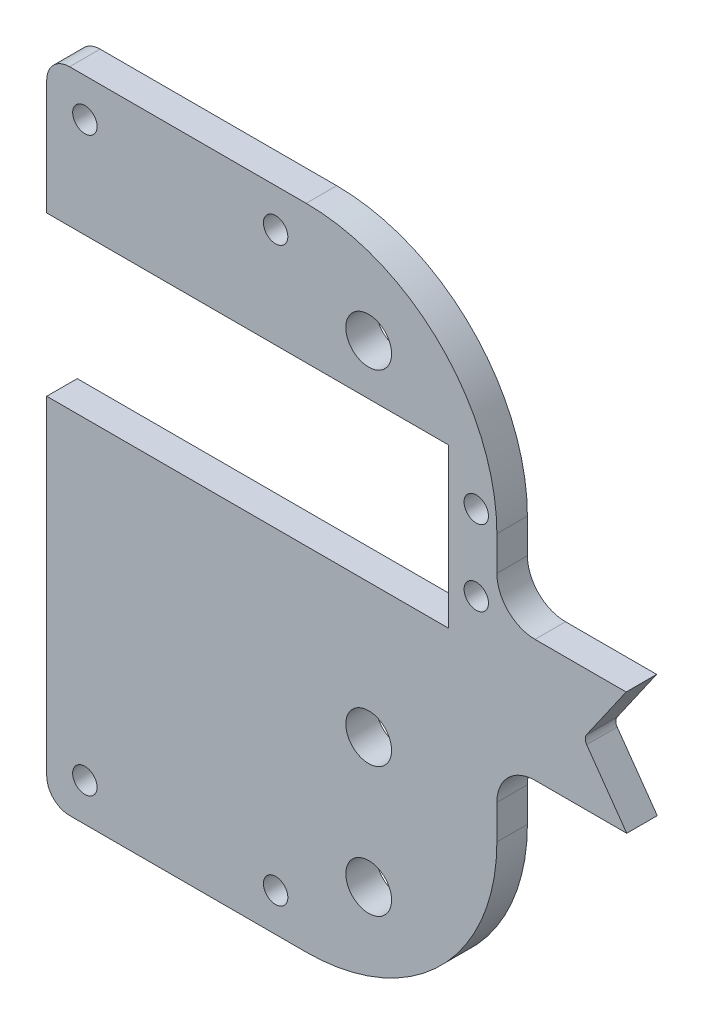
ISO-10303-21;
HEADER;
FILE_DESCRIPTION(('STEP AP214'),'2;1');
FILE_NAME('part.step','',(''),(''),'','','');
FILE_SCHEMA(('AUTOMOTIVE_DESIGN { 1 0 10303 214 1 1 1 1 }'));
ENDSEC;
DATA;
#1=APPLICATION_CONTEXT('core data for automotive mechanical design processes');
#2=APPLICATION_PROTOCOL_DEFINITION('international standard','automotive_design',2000,#1);
#3=PRODUCT_CONTEXT('',#1,'mechanical');
#4=PRODUCT('Part','Part','',(#3));
#5=PRODUCT_RELATED_PRODUCT_CATEGORY('part','',(#4));
#6=PRODUCT_DEFINITION_FORMATION('','',#4);
#7=PRODUCT_DEFINITION_CONTEXT('part definition',#1,'design');
#8=PRODUCT_DEFINITION('design','',#6,#7);
#9=PRODUCT_DEFINITION_SHAPE('','',#8);
#10=(LENGTH_UNIT() NAMED_UNIT(*) SI_UNIT(.MILLI.,.METRE.));
#11=(NAMED_UNIT(*) PLANE_ANGLE_UNIT() SI_UNIT($,.RADIAN.));
#12=(NAMED_UNIT(*) SI_UNIT($,.STERADIAN.) SOLID_ANGLE_UNIT());
#13=UNCERTAINTY_MEASURE_WITH_UNIT(LENGTH_MEASURE(1.E-05),#10,'distance_accuracy_value','');
#14=(GEOMETRIC_REPRESENTATION_CONTEXT(3) GLOBAL_UNCERTAINTY_ASSIGNED_CONTEXT((#13)) GLOBAL_UNIT_ASSIGNED_CONTEXT((#10,
#11,#12)) REPRESENTATION_CONTEXT('',''));
#15=CARTESIAN_POINT('',(0.,0.,0.));
#16=DIRECTION('',(0.,0.,1.));
#17=DIRECTION('',(1.,0.,0.));
#18=AXIS2_PLACEMENT_3D('',#15,#16,#17);
#19=CARTESIAN_POINT('',(26.9999999999998,0.,4.));
#20=DIRECTION('',(-1.,0.,0.));
#21=DIRECTION('',(0.,0.,1.));
#22=AXIS2_PLACEMENT_3D('',#19,#20,#21);
#23=PLANE('',#22);
#24=DIRECTION('',(0.,1.,0.));
#25=VECTOR('',#24,1.);
#26=CARTESIAN_POINT('',(26.9999999999998,0.,0.));
#27=LINE('',#26,#25);
#28=CARTESIAN_POINT('',(26.9999999999998,-5.99999999999988,0.));
#29=VERTEX_POINT('',#28);
#30=CARTESIAN_POINT('',(26.9999999999998,-1.4999999999999,0.));
#31=VERTEX_POINT('',#30);
#32=EDGE_CURVE('E332',#29,#31,#27,.T.);
#33=ORIENTED_EDGE('',*,*,#32,.T.);
#34=DIRECTION('',(0.,0.,-1.));
#35=VECTOR('',#34,1.);
#36=CARTESIAN_POINT('',(26.9999999999998,-1.4999999999999,4.));
#37=LINE('',#36,#35);
#38=CARTESIAN_POINT('',(26.9999999999998,-1.4999999999999,4.));
#39=VERTEX_POINT('',#38);
#40=EDGE_CURVE('E419',#31,#39,#37,.F.);
#41=ORIENTED_EDGE('',*,*,#40,.T.);
#42=DIRECTION('',(0.,1.,0.));
#43=VECTOR('',#42,1.);
#44=CARTESIAN_POINT('',(26.9999999999998,0.,4.));
#45=LINE('',#44,#43);
#46=CARTESIAN_POINT('',(26.9999999999998,-5.99999999999988,4.));
#47=VERTEX_POINT('',#46);
#48=EDGE_CURVE('E289',#47,#39,#45,.T.);
#49=ORIENTED_EDGE('',*,*,#48,.F.);
#50=DIRECTION('',(0.,0.,-1.));
#51=VECTOR('',#50,1.);
#52=CARTESIAN_POINT('',(26.9999999999998,-5.99999999999988,4.));
#53=LINE('',#52,#51);
#54=EDGE_CURVE('E392',#47,#29,#53,.T.);
#55=ORIENTED_EDGE('',*,*,#54,.T.);
#56=EDGE_LOOP('',(#33,#41,#49,#55));
#57=FACE_BOUND('',#56,.T.);
#58=ADVANCED_FACE('F40',(#57),#23,.F.);
#59=CARTESIAN_POINT('',(20.65,0.,4.));
#60=DIRECTION('',(-1.,0.,0.));
#61=DIRECTION('',(0.,0.,1.));
#62=AXIS2_PLACEMENT_3D('',#59,#60,#61);
#63=PLANE('',#62);
#64=DIRECTION('',(0.,1.,0.));
#65=VECTOR('',#64,1.);
#66=CARTESIAN_POINT('',(20.65,0.,0.));
#67=LINE('',#66,#65);
#68=CARTESIAN_POINT('',(20.65,15.1,0.));
#69=VERTEX_POINT('',#68);
#70=CARTESIAN_POINT('',(20.65,35.9,0.));
#71=VERTEX_POINT('',#70);
#72=EDGE_CURVE('E315',#69,#71,#67,.T.);
#73=ORIENTED_EDGE('',*,*,#72,.F.);
#74=DIRECTION('',(0.,0.,-1.));
#75=VECTOR('',#74,1.);
#76=CARTESIAN_POINT('',(20.65,15.1,4.));
#77=LINE('',#76,#75);
#78=CARTESIAN_POINT('',(20.65,15.1,4.));
#79=VERTEX_POINT('',#78);
#80=EDGE_CURVE('E352',#79,#69,#77,.T.);
#81=ORIENTED_EDGE('',*,*,#80,.F.);
#82=DIRECTION('',(0.,1.,0.));
#83=VECTOR('',#82,1.);
#84=CARTESIAN_POINT('',(20.65,0.,4.));
#85=LINE('',#84,#83);
#86=CARTESIAN_POINT('',(20.65,35.9,4.));
#87=VERTEX_POINT('',#86);
#88=EDGE_CURVE('E272',#79,#87,#85,.T.);
#89=ORIENTED_EDGE('',*,*,#88,.T.);
#90=DIRECTION('',(0.,0.,-1.));
#91=VECTOR('',#90,1.);
#92=CARTESIAN_POINT('',(20.65,35.9,4.));
#93=LINE('',#92,#91);
#94=EDGE_CURVE('E299',#87,#71,#93,.T.);
#95=ORIENTED_EDGE('',*,*,#94,.T.);
#96=EDGE_LOOP('',(#73,#81,#89,#95));
#97=FACE_BOUND('',#96,.T.);
#98=ADVANCED_FACE('F537',(#97),#63,.T.);
#99=CARTESIAN_POINT('',(0.,15.1,4.));
#100=DIRECTION('',(0.,1.,0.));
#101=DIRECTION('',(0.,0.,1.));
#102=AXIS2_PLACEMENT_3D('',#99,#100,#101);
#103=PLANE('',#102);
#104=DIRECTION('',(1.,0.,0.));
#105=VECTOR('',#104,1.);
#106=CARTESIAN_POINT('',(0.,15.1,0.));
#107=LINE('',#106,#105);
#108=CARTESIAN_POINT('',(-32.0000000000001,15.1,0.));
#109=VERTEX_POINT('',#108);
#110=EDGE_CURVE('E319',#109,#69,#107,.T.);
#111=ORIENTED_EDGE('',*,*,#110,.F.);
#112=DIRECTION('',(0.,0.,-1.));
#113=VECTOR('',#112,1.);
#114=CARTESIAN_POINT('',(-32.0000000000001,15.1,4.));
#115=LINE('',#114,#113);
#116=CARTESIAN_POINT('',(-32.0000000000001,15.1,4.));
#117=VERTEX_POINT('',#116);
#118=EDGE_CURVE('E348',#117,#109,#115,.T.);
#119=ORIENTED_EDGE('',*,*,#118,.F.);
#120=DIRECTION('',(1.,0.,0.));
#121=VECTOR('',#120,1.);
#122=CARTESIAN_POINT('',(0.,15.1,4.));
#123=LINE('',#122,#121);
#124=EDGE_CURVE('E276',#117,#79,#123,.T.);
#125=ORIENTED_EDGE('',*,*,#124,.T.);
#126=ORIENTED_EDGE('',*,*,#80,.T.);
#127=EDGE_LOOP('',(#111,#119,#125,#126));
#128=FACE_BOUND('',#127,.T.);
#129=ADVANCED_FACE('F543',(#128),#103,.T.);
#130=CARTESIAN_POINT('',(-32.0000000000001,0.,4.));
#131=DIRECTION('',(-1.,0.,0.));
#132=DIRECTION('',(0.,0.,1.));
#133=AXIS2_PLACEMENT_3D('',#130,#131,#132);
#134=PLANE('',#133);
#135=DIRECTION('',(0.,1.,0.));
#136=VECTOR('',#135,1.);
#137=CARTESIAN_POINT('',(-32.0000000000001,0.,0.));
#138=LINE('',#137,#136);
#139=CARTESIAN_POINT('',(-32.0000000000001,-27.9999999999999,0.));
#140=VERTEX_POINT('',#139);
#141=EDGE_CURVE('E323',#140,#109,#138,.T.);
#142=ORIENTED_EDGE('',*,*,#141,.F.);
#143=DIRECTION('',(0.,0.,-1.));
#144=VECTOR('',#143,1.);
#145=CARTESIAN_POINT('',(-32.0000000000001,-27.9999999999999,4.));
#146=LINE('',#145,#144);
#147=CARTESIAN_POINT('',(-32.0000000000001,-27.9999999999999,4.));
#148=VERTEX_POINT('',#147);
#149=EDGE_CURVE('E378',#140,#148,#146,.F.);
#150=ORIENTED_EDGE('',*,*,#149,.T.);
#151=DIRECTION('',(0.,1.,0.));
#152=VECTOR('',#151,1.);
#153=CARTESIAN_POINT('',(-32.0000000000001,0.,4.));
#154=LINE('',#153,#152);
#155=EDGE_CURVE('E280',#148,#117,#154,.T.);
#156=ORIENTED_EDGE('',*,*,#155,.T.);
#157=ORIENTED_EDGE('',*,*,#118,.T.);
#158=EDGE_LOOP('',(#142,#150,#156,#157));
#159=FACE_BOUND('',#158,.T.);
#160=ADVANCED_FACE('F554',(#159),#134,.T.);
#161=CARTESIAN_POINT('',(0.,-30.9999999999999,4.));
#162=DIRECTION('',(0.,1.,0.));
#163=DIRECTION('',(0.,0.,1.));
#164=AXIS2_PLACEMENT_3D('',#161,#162,#163);
#165=PLANE('',#164);
#166=DIRECTION('',(1.,0.,0.));
#167=VECTOR('',#166,1.);
#168=CARTESIAN_POINT('',(0.,-30.9999999999999,0.));
#169=LINE('',#168,#167);
#170=CARTESIAN_POINT('',(-29.0000000000001,-30.9999999999999,0.));
#171=VERTEX_POINT('',#170);
#172=CARTESIAN_POINT('',(1.9999999999998,-30.9999999999999,0.));
#173=VERTEX_POINT('',#172);
#174=EDGE_CURVE('E326',#171,#173,#169,.T.);
#175=ORIENTED_EDGE('',*,*,#174,.T.);
#176=DIRECTION('',(0.,0.,-1.));
#177=VECTOR('',#176,1.);
#178=CARTESIAN_POINT('',(1.9999999999998,-30.9999999999999,4.));
#179=LINE('',#178,#177);
#180=CARTESIAN_POINT('',(1.9999999999998,-30.9999999999999,4.));
#181=VERTEX_POINT('',#180);
#182=EDGE_CURVE('E406',#173,#181,#179,.F.);
#183=ORIENTED_EDGE('',*,*,#182,.T.);
#184=DIRECTION('',(1.,0.,0.));
#185=VECTOR('',#184,1.);
#186=CARTESIAN_POINT('',(0.,-30.9999999999999,4.));
#187=LINE('',#186,#185);
#188=CARTESIAN_POINT('',(-29.0000000000001,-30.9999999999999,4.));
#189=VERTEX_POINT('',#188);
#190=EDGE_CURVE('E283',#189,#181,#187,.T.);
#191=ORIENTED_EDGE('',*,*,#190,.F.);
#192=DIRECTION('',(0.,0.,-1.));
#193=VECTOR('',#192,1.);
#194=CARTESIAN_POINT('',(-29.0000000000001,-30.9999999999999,0.));
#195=LINE('',#194,#193);
#196=EDGE_CURVE('E374',#189,#171,#195,.T.);
#197=ORIENTED_EDGE('',*,*,#196,.T.);
#198=EDGE_LOOP('',(#175,#183,#191,#197));
#199=FACE_BOUND('',#198,.T.);
#200=ADVANCED_FACE('F549',(#199),#165,.F.);
#201=CARTESIAN_POINT('',(26.9999999999998,24.5000000000001,4.));
#202=VERTEX_POINT('',#201);
#203=CARTESIAN_POINT('',(26.9999999999998,29.0000000000001,4.));
#204=VERTEX_POINT('',#203);
#205=EDGE_CURVE('E288',#202,#204,#45,.T.);
#206=ORIENTED_EDGE('',*,*,#205,.F.);
#207=DIRECTION('',(0.,0.,-1.));
#208=VECTOR('',#207,1.);
#209=CARTESIAN_POINT('',(26.9999999999998,24.5000000000001,4.));
#210=LINE('',#209,#208);
#211=CARTESIAN_POINT('',(26.9999999999998,24.5000000000001,0.));
#212=VERTEX_POINT('',#211);
#213=EDGE_CURVE('E409',#202,#212,#210,.T.);
#214=ORIENTED_EDGE('',*,*,#213,.T.);
#215=CARTESIAN_POINT('',(26.9999999999998,29.0000000000001,0.));
#216=VERTEX_POINT('',#215);
#217=EDGE_CURVE('E331',#212,#216,#27,.T.);
#218=ORIENTED_EDGE('',*,*,#217,.T.);
#219=DIRECTION('',(0.,0.,-1.));
#220=VECTOR('',#219,1.);
#221=CARTESIAN_POINT('',(26.9999999999998,29.0000000000001,4.));
#222=LINE('',#221,#220);
#223=EDGE_CURVE('E396',#216,#204,#222,.F.);
#224=ORIENTED_EDGE('',*,*,#223,.T.);
#225=EDGE_LOOP('',(#206,#214,#218,#224));
#226=FACE_BOUND('',#225,.T.);
#227=ADVANCED_FACE('F516',(#226),#23,.F.);
#228=CARTESIAN_POINT('',(0.,54.0000000000001,4.));
#229=DIRECTION('',(0.,1.,0.));
#230=DIRECTION('',(0.,0.,1.));
#231=AXIS2_PLACEMENT_3D('',#228,#229,#230);
#232=PLANE('',#231);
#233=DIRECTION('',(1.,0.,0.));
#234=VECTOR('',#233,1.);
#235=CARTESIAN_POINT('',(0.,54.0000000000001,4.));
#236=LINE('',#235,#234);
#237=CARTESIAN_POINT('',(-29.0000000000001,54.0000000000001,4.));
#238=VERTEX_POINT('',#237);
#239=CARTESIAN_POINT('',(1.9999999999998,54.0000000000001,4.));
#240=VERTEX_POINT('',#239);
#241=EDGE_CURVE('E292',#238,#240,#236,.T.);
#242=ORIENTED_EDGE('',*,*,#241,.T.);
#243=DIRECTION('',(0.,0.,-1.));
#244=VECTOR('',#243,1.);
#245=CARTESIAN_POINT('',(1.9999999999998,54.0000000000001,0.));
#246=LINE('',#245,#244);
#247=CARTESIAN_POINT('',(1.9999999999998,54.0000000000001,0.));
#248=VERTEX_POINT('',#247);
#249=EDGE_CURVE('E381',#240,#248,#246,.T.);
#250=ORIENTED_EDGE('',*,*,#249,.T.);
#251=DIRECTION('',(1.,0.,0.));
#252=VECTOR('',#251,1.);
#253=CARTESIAN_POINT('',(0.,54.0000000000001,0.));
#254=LINE('',#253,#252);
#255=CARTESIAN_POINT('',(-29.0000000000001,54.0000000000001,0.));
#256=VERTEX_POINT('',#255);
#257=EDGE_CURVE('E336',#256,#248,#254,.T.);
#258=ORIENTED_EDGE('',*,*,#257,.F.);
#259=DIRECTION('',(0.,0.,-1.));
#260=VECTOR('',#259,1.);
#261=CARTESIAN_POINT('',(-29.0000000000001,54.0000000000001,4.));
#262=LINE('',#261,#260);
#263=EDGE_CURVE('E365',#256,#238,#262,.F.);
#264=ORIENTED_EDGE('',*,*,#263,.T.);
#265=EDGE_LOOP('',(#242,#250,#258,#264));
#266=FACE_BOUND('',#265,.T.);
#267=ADVANCED_FACE('F499',(#266),#232,.T.);
#268=CARTESIAN_POINT('',(-32.0000000000001,35.9,4.));
#269=VERTEX_POINT('',#268);
#270=CARTESIAN_POINT('',(-32.0000000000001,51.0000000000001,4.));
#271=VERTEX_POINT('',#270);
#272=EDGE_CURVE('E284',#269,#271,#154,.T.);
#273=ORIENTED_EDGE('',*,*,#272,.T.);
#274=DIRECTION('',(0.,0.,-1.));
#275=VECTOR('',#274,1.);
#276=CARTESIAN_POINT('',(-32.0000000000001,51.0000000000001,4.));
#277=LINE('',#276,#275);
#278=CARTESIAN_POINT('',(-32.0000000000001,51.0000000000001,0.));
#279=VERTEX_POINT('',#278);
#280=EDGE_CURVE('E355',#271,#279,#277,.T.);
#281=ORIENTED_EDGE('',*,*,#280,.T.);
#282=CARTESIAN_POINT('',(-32.0000000000001,35.9,0.));
#283=VERTEX_POINT('',#282);
#284=EDGE_CURVE('E327',#283,#279,#138,.T.);
#285=ORIENTED_EDGE('',*,*,#284,.F.);
#286=DIRECTION('',(0.,0.,-1.));
#287=VECTOR('',#286,1.);
#288=CARTESIAN_POINT('',(-32.0000000000001,35.9,4.));
#289=LINE('',#288,#287);
#290=EDGE_CURVE('E345',#269,#283,#289,.T.);
#291=ORIENTED_EDGE('',*,*,#290,.F.);
#292=EDGE_LOOP('',(#273,#281,#285,#291));
#293=FACE_BOUND('',#292,.T.);
#294=ADVANCED_FACE('F485',(#293),#134,.T.);
#295=CARTESIAN_POINT('',(24.2999999999991,30.4499999999996,4.));
#296=DIRECTION('',(0.,0.,-1.));
#297=DIRECTION('',(-1.,0.,0.));
#298=AXIS2_PLACEMENT_3D('',#295,#296,#297);
#299=CYLINDRICAL_SURFACE('',#298,1.60000000000101);
#300=CARTESIAN_POINT('',(24.2999999999991,30.4499999999996,4.));
#301=DIRECTION('',(0.,0.,1.));
#302=DIRECTION('',(1.,0.,0.));
#303=AXIS2_PLACEMENT_3D('',#300,#301,#302);
#304=CIRCLE('',#303,1.60000000000101);
#305=CARTESIAN_POINT('',(25.9000000000001,30.4499999999996,4.));
#306=VERTEX_POINT('',#305);
#307=EDGE_CURVE('E268',#306,#306,#304,.T.);
#308=ORIENTED_EDGE('',*,*,#307,.T.);
#309=EDGE_LOOP('',(#308));
#310=FACE_BOUND('',#309,.T.);
#311=CARTESIAN_POINT('',(24.2999999999991,30.4499999999996,0.));
#312=DIRECTION('',(0.,0.,1.));
#313=DIRECTION('',(1.,0.,0.));
#314=AXIS2_PLACEMENT_3D('',#311,#312,#313);
#315=CIRCLE('',#314,1.60000000000101);
#316=CARTESIAN_POINT('',(25.9000000000001,30.4499999999996,0.));
#317=VERTEX_POINT('',#316);
#318=EDGE_CURVE('E311',#317,#317,#315,.T.);
#319=ORIENTED_EDGE('',*,*,#318,.F.);
#320=EDGE_LOOP('',(#319));
#321=FACE_BOUND('',#320,.T.);
#322=ADVANCED_FACE('F481',(#310,#321),#299,.F.);
#323=CARTESIAN_POINT('',(24.2999999999993,20.5499999999996,4.));
#324=DIRECTION('',(0.,0.,-1.));
#325=DIRECTION('',(-1.,0.,0.));
#326=AXIS2_PLACEMENT_3D('',#323,#324,#325);
#327=CYLINDRICAL_SURFACE('',#326,1.60000000000081);
#328=CARTESIAN_POINT('',(24.2999999999993,20.5499999999996,4.));
#329=DIRECTION('',(0.,0.,1.));
#330=DIRECTION('',(1.,0.,0.));
#331=AXIS2_PLACEMENT_3D('',#328,#329,#330);
#332=CIRCLE('',#331,1.60000000000081);
#333=CARTESIAN_POINT('',(25.9000000000001,20.5499999999996,4.));
#334=VERTEX_POINT('',#333);
#335=EDGE_CURVE('E264',#334,#334,#332,.T.);
#336=ORIENTED_EDGE('',*,*,#335,.T.);
#337=EDGE_LOOP('',(#336));
#338=FACE_BOUND('',#337,.T.);
#339=CARTESIAN_POINT('',(24.2999999999993,20.5499999999996,0.));
#340=DIRECTION('',(0.,0.,1.));
#341=DIRECTION('',(1.,0.,0.));
#342=AXIS2_PLACEMENT_3D('',#339,#340,#341);
#343=CIRCLE('',#342,1.60000000000081);
#344=CARTESIAN_POINT('',(25.9000000000001,20.5499999999996,0.));
#345=VERTEX_POINT('',#344);
#346=EDGE_CURVE('E307',#345,#345,#343,.T.);
#347=ORIENTED_EDGE('',*,*,#346,.F.);
#348=EDGE_LOOP('',(#347));
#349=FACE_BOUND('',#348,.T.);
#350=ADVANCED_FACE('F484',(#338,#349),#327,.F.);
#351=CARTESIAN_POINT('',(10.1999999999959,-19.5000000000021,4.));
#352=DIRECTION('',(0.,0.,-1.));
#353=DIRECTION('',(-1.,0.,0.));
#354=AXIS2_PLACEMENT_3D('',#351,#352,#353);
#355=CYLINDRICAL_SURFACE('',#354,3.0000000000037);
#356=CARTESIAN_POINT('',(10.1999999999959,-19.5000000000021,4.));
#357=DIRECTION('',(0.,0.,1.));
#358=DIRECTION('',(1.,0.,0.));
#359=AXIS2_PLACEMENT_3D('',#356,#357,#358);
#360=CIRCLE('',#359,3.0000000000037);
#361=CARTESIAN_POINT('',(13.1999999999996,-19.5000000000021,4.));
#362=VERTEX_POINT('',#361);
#363=EDGE_CURVE('E259',#362,#362,#360,.T.);
#364=ORIENTED_EDGE('',*,*,#363,.T.);
#365=EDGE_LOOP('',(#364));
#366=FACE_BOUND('',#365,.T.);
#367=CARTESIAN_POINT('',(10.1999999999959,-19.5000000000021,0.));
#368=DIRECTION('',(0.,0.,1.));
#369=DIRECTION('',(1.,0.,0.));
#370=AXIS2_PLACEMENT_3D('',#367,#368,#369);
#371=CIRCLE('',#370,3.0000000000037);
#372=CARTESIAN_POINT('',(13.1999999999996,-19.5000000000021,0.));
#373=VERTEX_POINT('',#372);
#374=EDGE_CURVE('E303',#373,#373,#371,.T.);
#375=ORIENTED_EDGE('',*,*,#374,.F.);
#376=EDGE_LOOP('',(#375));
#377=FACE_BOUND('',#376,.T.);
#378=ADVANCED_FACE('F567',(#366,#377),#355,.F.);
#379=CARTESIAN_POINT('',(10.1999999999994,42.4999999999991,4.));
#380=DIRECTION('',(0.,0.,-1.));
#381=DIRECTION('',(-1.,0.,0.));
#382=AXIS2_PLACEMENT_3D('',#379,#380,#381);
#383=CYLINDRICAL_SURFACE('',#382,3.00000000000011);
#384=CARTESIAN_POINT('',(10.1999999999994,42.4999999999991,4.));
#385=DIRECTION('',(0.,0.,1.));
#386=DIRECTION('',(1.,0.,0.));
#387=AXIS2_PLACEMENT_3D('',#384,#385,#386);
#388=CIRCLE('',#387,3.00000000000011);
#389=CARTESIAN_POINT('',(13.1999999999995,42.4999999999991,4.));
#390=VERTEX_POINT('',#389);
#391=EDGE_CURVE('E255',#390,#390,#388,.T.);
#392=ORIENTED_EDGE('',*,*,#391,.T.);
#393=EDGE_LOOP('',(#392));
#394=FACE_BOUND('',#393,.T.);
#395=CARTESIAN_POINT('',(10.1999999999994,42.4999999999991,0.));
#396=DIRECTION('',(0.,0.,1.));
#397=DIRECTION('',(1.,0.,0.));
#398=AXIS2_PLACEMENT_3D('',#395,#396,#397);
#399=CIRCLE('',#398,3.00000000000011);
#400=CARTESIAN_POINT('',(13.1999999999995,42.4999999999991,0.));
#401=VERTEX_POINT('',#400);
#402=EDGE_CURVE('E254',#401,#401,#399,.T.);
#403=ORIENTED_EDGE('',*,*,#402,.F.);
#404=EDGE_LOOP('',(#403));
#405=FACE_BOUND('',#404,.T.);
#406=ADVANCED_FACE('F571',(#394,#405),#383,.F.);
#407=CARTESIAN_POINT('',(0.,35.9,4.));
#408=DIRECTION('',(0.,1.,0.));
#409=DIRECTION('',(0.,0.,1.));
#410=AXIS2_PLACEMENT_3D('',#407,#408,#409);
#411=PLANE('',#410);
#412=DIRECTION('',(1.,0.,0.));
#413=VECTOR('',#412,1.);
#414=CARTESIAN_POINT('',(0.,35.9,0.));
#415=LINE('',#414,#413);
#416=EDGE_CURVE('E260',#283,#71,#415,.T.);
#417=ORIENTED_EDGE('',*,*,#416,.T.);
#418=ORIENTED_EDGE('',*,*,#94,.F.);
#419=DIRECTION('',(1.,0.,0.));
#420=VECTOR('',#419,1.);
#421=CARTESIAN_POINT('',(0.,35.9,4.));
#422=LINE('',#421,#420);
#423=EDGE_CURVE('E296',#269,#87,#422,.T.);
#424=ORIENTED_EDGE('',*,*,#423,.F.);
#425=ORIENTED_EDGE('',*,*,#290,.T.);
#426=EDGE_LOOP('',(#417,#418,#424,#425));
#427=FACE_BOUND('',#426,.T.);
#428=ADVANCED_FACE('F464',(#427),#411,.F.);
#429=CARTESIAN_POINT('',(0.,0.,4.));
#430=DIRECTION('',(0.,0.,1.));
#431=DIRECTION('',(1.,0.,0.));
#432=AXIS2_PLACEMENT_3D('',#429,#430,#431);
#433=PLANE('',#432);
#434=CARTESIAN_POINT('',(-2.00000000000428,-26.0000000000021,4.));
#435=DIRECTION('',(0.,0.,1.));
#436=DIRECTION('',(1.,0.,0.));
#437=AXIS2_PLACEMENT_3D('',#434,#435,#436);
#438=CIRCLE('',#437,1.59999999999655);
#439=CARTESIAN_POINT('',(-0.400000000007735,-26.0000000000021,4.));
#440=VERTEX_POINT('',#439);
#441=EDGE_CURVE('E443',#440,#440,#438,.T.);
#442=ORIENTED_EDGE('',*,*,#441,.F.);
#443=EDGE_LOOP('',(#442));
#444=FACE_BOUND('',#443,.T.);
#445=CARTESIAN_POINT('',(-2.0000000000044,48.9999999999979,4.));
#446=DIRECTION('',(0.,0.,1.));
#447=DIRECTION('',(1.,0.,0.));
#448=AXIS2_PLACEMENT_3D('',#445,#446,#447);
#449=CIRCLE('',#448,1.59999999999655);
#450=CARTESIAN_POINT('',(-0.400000000007854,48.9999999999979,4.));
#451=VERTEX_POINT('',#450);
#452=EDGE_CURVE('E450',#451,#451,#449,.T.);
#453=ORIENTED_EDGE('',*,*,#452,.F.);
#454=EDGE_LOOP('',(#453));
#455=FACE_BOUND('',#454,.T.);
#456=CARTESIAN_POINT('',(10.1999999999956,-2.5000000000021,4.));
#457=DIRECTION('',(0.,0.,1.));
#458=DIRECTION('',(1.,0.,0.));
#459=AXIS2_PLACEMENT_3D('',#456,#457,#458);
#460=CIRCLE('',#459,2.99999999999695);
#461=CARTESIAN_POINT('',(13.1999999999926,-2.5000000000021,4.));
#462=VERTEX_POINT('',#461);
#463=EDGE_CURVE('E234',#462,#462,#460,.T.);
#464=ORIENTED_EDGE('',*,*,#463,.F.);
#465=EDGE_LOOP('',(#464));
#466=FACE_BOUND('',#465,.T.);
#467=CARTESIAN_POINT('',(-27.0000000000044,48.9999999999979,4.));
#468=DIRECTION('',(0.,0.,1.));
#469=DIRECTION('',(1.,0.,0.));
#470=AXIS2_PLACEMENT_3D('',#467,#468,#469);
#471=CIRCLE('',#470,1.59999999999655);
#472=CARTESIAN_POINT('',(-25.4000000000079,48.9999999999979,4.));
#473=VERTEX_POINT('',#472);
#474=EDGE_CURVE('E250',#473,#473,#471,.T.);
#475=ORIENTED_EDGE('',*,*,#474,.F.);
#476=EDGE_LOOP('',(#475));
#477=FACE_BOUND('',#476,.T.);
#478=CARTESIAN_POINT('',(-27.0000000000044,-26.0000000000021,4.));
#479=DIRECTION('',(0.,0.,1.));
#480=DIRECTION('',(1.,0.,0.));
#481=AXIS2_PLACEMENT_3D('',#478,#479,#480);
#482=CIRCLE('',#481,1.59999999999655);
#483=CARTESIAN_POINT('',(-25.4000000000079,-26.0000000000021,4.));
#484=VERTEX_POINT('',#483);
#485=EDGE_CURVE('E243',#484,#484,#482,.T.);
#486=ORIENTED_EDGE('',*,*,#485,.F.);
#487=EDGE_LOOP('',(#486));
#488=FACE_BOUND('',#487,.T.);
#489=ORIENTED_EDGE('',*,*,#391,.F.);
#490=EDGE_LOOP('',(#489));
#491=FACE_BOUND('',#490,.T.);
#492=ORIENTED_EDGE('',*,*,#363,.F.);
#493=EDGE_LOOP('',(#492));
#494=FACE_BOUND('',#493,.T.);
#495=ORIENTED_EDGE('',*,*,#335,.F.);
#496=EDGE_LOOP('',(#495));
#497=FACE_BOUND('',#496,.T.);
#498=ORIENTED_EDGE('',*,*,#307,.F.);
#499=EDGE_LOOP('',(#498));
#500=FACE_BOUND('',#499,.T.);
#501=ORIENTED_EDGE('',*,*,#48,.T.);
#502=CARTESIAN_POINT('',(31.9999999999998,-1.4999999999999,4.));
#503=DIRECTION('',(0.,0.,1.));
#504=DIRECTION('',(1.,0.,0.));
#505=AXIS2_PLACEMENT_3D('',#502,#503,#504);
#506=CIRCLE('',#505,5.);
#507=CARTESIAN_POINT('',(31.9999999999998,3.5000000000001,4.));
#508=VERTEX_POINT('',#507);
#509=EDGE_CURVE('E431',#39,#508,#506,.F.);
#510=ORIENTED_EDGE('',*,*,#509,.T.);
#511=DIRECTION('',(-1.,0.,0.));
#512=VECTOR('',#511,1.);
#513=CARTESIAN_POINT('',(44.0235612145208,3.5000000000001,4.));
#514=LINE('',#513,#512);
#515=CARTESIAN_POINT('',(44.0235612145208,3.5000000000001,4.));
#516=VERTEX_POINT('',#515);
#517=EDGE_CURVE('E201',#516,#508,#514,.T.);
#518=ORIENTED_EDGE('',*,*,#517,.F.);
#519=DIRECTION('',(0.577520932344641,-0.816375877095702,0.));
#520=VECTOR('',#519,1.);
#521=CARTESIAN_POINT('',(38.3641981828819,11.5000000000001,4.));
#522=LINE('',#521,#520);
#523=CARTESIAN_POINT('',(38.769915842531,10.9264829347319,4.));
#524=VERTEX_POINT('',#523);
#525=EDGE_CURVE('E207',#524,#516,#522,.T.);
#526=ORIENTED_EDGE('',*,*,#525,.F.);
#527=CARTESIAN_POINT('',(39.5862917196267,11.5040038670766,4.));
#528=DIRECTION('',(0.,0.,1.));
#529=DIRECTION('',(1.,0.,0.));
#530=AXIS2_PLACEMENT_3D('',#527,#528,#529);
#531=CIRCLE('',#530,1.);
#532=CARTESIAN_POINT('',(38.7661492185052,12.0761631786798,4.));
#533=VERTEX_POINT('',#532);
#534=EDGE_CURVE('E11',#524,#533,#531,.F.);
#535=ORIENTED_EDGE('',*,*,#534,.T.);
#536=DIRECTION('',(-0.572159311603183,-0.820142501121465,0.));
#537=VECTOR('',#536,1.);
#538=CARTESIAN_POINT('',(43.9452703582252,19.5000000000001,4.));
#539=LINE('',#538,#537);
#540=CARTESIAN_POINT('',(43.9452703582252,19.5000000000001,4.));
#541=VERTEX_POINT('',#540);
#542=EDGE_CURVE('E190',#541,#533,#539,.T.);
#543=ORIENTED_EDGE('',*,*,#542,.F.);
#544=DIRECTION('',(1.,0.,0.));
#545=VECTOR('',#544,1.);
#546=CARTESIAN_POINT('',(26.9999999999998,19.5000000000001,4.));
#547=LINE('',#546,#545);
#548=CARTESIAN_POINT('',(31.9999999999998,19.5000000000001,4.));
#549=VERTEX_POINT('',#548);
#550=EDGE_CURVE('E178',#549,#541,#547,.T.);
#551=ORIENTED_EDGE('',*,*,#550,.F.);
#552=CARTESIAN_POINT('',(31.9999999999998,24.5000000000001,4.));
#553=DIRECTION('',(0.,0.,1.));
#554=DIRECTION('',(1.,0.,0.));
#555=AXIS2_PLACEMENT_3D('',#552,#553,#554);
#556=CIRCLE('',#555,5.);
#557=EDGE_CURVE('E425',#549,#202,#556,.F.);
#558=ORIENTED_EDGE('',*,*,#557,.T.);
#559=ORIENTED_EDGE('',*,*,#205,.T.);
#560=CARTESIAN_POINT('',(1.9999999999998,29.0000000000001,4.));
#561=DIRECTION('',(0.,0.,1.));
#562=DIRECTION('',(1.,0.,0.));
#563=AXIS2_PLACEMENT_3D('',#560,#561,#562);
#564=CIRCLE('',#563,25.);
#565=EDGE_CURVE('E403',#204,#240,#564,.T.);
#566=ORIENTED_EDGE('',*,*,#565,.T.);
#567=ORIENTED_EDGE('',*,*,#241,.F.);
#568=CARTESIAN_POINT('',(-29.0000000000001,51.0000000000001,4.));
#569=DIRECTION('',(0.,0.,1.));
#570=DIRECTION('',(1.,0.,0.));
#571=AXIS2_PLACEMENT_3D('',#568,#569,#570);
#572=CIRCLE('',#571,3.);
#573=EDGE_CURVE('E371',#238,#271,#572,.T.);
#574=ORIENTED_EDGE('',*,*,#573,.T.);
#575=ORIENTED_EDGE('',*,*,#272,.F.);
#576=ORIENTED_EDGE('',*,*,#423,.T.);
#577=ORIENTED_EDGE('',*,*,#88,.F.);
#578=ORIENTED_EDGE('',*,*,#124,.F.);
#579=ORIENTED_EDGE('',*,*,#155,.F.);
#580=CARTESIAN_POINT('',(-29.0000000000001,-27.9999999999999,4.));
#581=DIRECTION('',(0.,0.,1.));
#582=DIRECTION('',(1.,0.,0.));
#583=AXIS2_PLACEMENT_3D('',#580,#581,#582);
#584=CIRCLE('',#583,3.);
#585=EDGE_CURVE('E368',#148,#189,#584,.T.);
#586=ORIENTED_EDGE('',*,*,#585,.T.);
#587=ORIENTED_EDGE('',*,*,#190,.T.);
#588=CARTESIAN_POINT('',(1.9999999999998,-5.99999999999988,4.));
#589=DIRECTION('',(0.,0.,1.));
#590=DIRECTION('',(1.,0.,0.));
#591=AXIS2_PLACEMENT_3D('',#588,#589,#590);
#592=CIRCLE('',#591,25.);
#593=EDGE_CURVE('E400',#181,#47,#592,.T.);
#594=ORIENTED_EDGE('',*,*,#593,.T.);
#595=EDGE_LOOP('',(#501,#510,#518,#526,#535,#543,#551,#558,#559,#566,#567,#574,#575,#576,#577,
#578,#579,#586,#587,#594));
#596=FACE_BOUND('',#595,.T.);
#597=ADVANCED_FACE('F204',(#444,#455,#466,#477,#488,#491,#494,#497,#500,#596),#433,.T.);
#598=CARTESIAN_POINT('',(0.,0.,0.));
#599=DIRECTION('',(0.,0.,1.));
#600=DIRECTION('',(1.,0.,0.));
#601=AXIS2_PLACEMENT_3D('',#598,#599,#600);
#602=PLANE('',#601);
#603=CARTESIAN_POINT('',(-2.00000000000428,-26.0000000000021,0.));
#604=DIRECTION('',(0.,0.,1.));
#605=DIRECTION('',(1.,0.,0.));
#606=AXIS2_PLACEMENT_3D('',#603,#604,#605);
#607=CIRCLE('',#606,1.59999999999655);
#608=CARTESIAN_POINT('',(-0.400000000007735,-26.0000000000021,0.));
#609=VERTEX_POINT('',#608);
#610=EDGE_CURVE('E44',#609,#609,#607,.T.);
#611=ORIENTED_EDGE('',*,*,#610,.T.);
#612=EDGE_LOOP('',(#611));
#613=FACE_BOUND('',#612,.T.);
#614=CARTESIAN_POINT('',(-2.0000000000044,48.9999999999979,0.));
#615=DIRECTION('',(0.,0.,1.));
#616=DIRECTION('',(1.,0.,0.));
#617=AXIS2_PLACEMENT_3D('',#614,#615,#616);
#618=CIRCLE('',#617,1.59999999999655);
#619=CARTESIAN_POINT('',(-0.400000000007854,48.9999999999979,0.));
#620=VERTEX_POINT('',#619);
#621=EDGE_CURVE('E440',#620,#620,#618,.T.);
#622=ORIENTED_EDGE('',*,*,#621,.T.);
#623=EDGE_LOOP('',(#622));
#624=FACE_BOUND('',#623,.T.);
#625=CARTESIAN_POINT('',(10.1999999999956,-2.5000000000021,0.));
#626=DIRECTION('',(0.,0.,-1.));
#627=DIRECTION('',(-1.,0.,0.));
#628=AXIS2_PLACEMENT_3D('',#625,#626,#627);
#629=CIRCLE('',#628,2.99999999999695);
#630=CARTESIAN_POINT('',(7.1999999999987,-2.5000000000021,0.));
#631=VERTEX_POINT('',#630);
#632=EDGE_CURVE('E229',#631,#631,#629,.T.);
#633=ORIENTED_EDGE('',*,*,#632,.F.);
#634=EDGE_LOOP('',(#633));
#635=FACE_BOUND('',#634,.T.);
#636=CARTESIAN_POINT('',(-27.0000000000044,48.9999999999979,0.));
#637=DIRECTION('',(0.,0.,-1.));
#638=DIRECTION('',(-1.,0.,0.));
#639=AXIS2_PLACEMENT_3D('',#636,#637,#638);
#640=CIRCLE('',#639,1.59999999999655);
#641=CARTESIAN_POINT('',(-28.6000000000009,48.9999999999979,0.));
#642=VERTEX_POINT('',#641);
#643=EDGE_CURVE('E239',#642,#642,#640,.T.);
#644=ORIENTED_EDGE('',*,*,#643,.F.);
#645=EDGE_LOOP('',(#644));
#646=FACE_BOUND('',#645,.T.);
#647=CARTESIAN_POINT('',(-27.0000000000044,-26.0000000000021,0.));
#648=DIRECTION('',(0.,0.,-1.));
#649=DIRECTION('',(-1.,0.,0.));
#650=AXIS2_PLACEMENT_3D('',#647,#648,#649);
#651=CIRCLE('',#650,1.59999999999655);
#652=CARTESIAN_POINT('',(-28.6000000000009,-26.0000000000021,0.));
#653=VERTEX_POINT('',#652);
#654=EDGE_CURVE('E238',#653,#653,#651,.T.);
#655=ORIENTED_EDGE('',*,*,#654,.F.);
#656=EDGE_LOOP('',(#655));
#657=FACE_BOUND('',#656,.T.);
#658=ORIENTED_EDGE('',*,*,#402,.T.);
#659=EDGE_LOOP('',(#658));
#660=FACE_BOUND('',#659,.T.);
#661=ORIENTED_EDGE('',*,*,#374,.T.);
#662=EDGE_LOOP('',(#661));
#663=FACE_BOUND('',#662,.T.);
#664=ORIENTED_EDGE('',*,*,#346,.T.);
#665=EDGE_LOOP('',(#664));
#666=FACE_BOUND('',#665,.T.);
#667=ORIENTED_EDGE('',*,*,#318,.T.);
#668=EDGE_LOOP('',(#667));
#669=FACE_BOUND('',#668,.T.);
#670=ORIENTED_EDGE('',*,*,#257,.T.);
#671=CARTESIAN_POINT('',(1.9999999999998,29.0000000000001,0.));
#672=DIRECTION('',(0.,0.,1.));
#673=DIRECTION('',(1.,0.,0.));
#674=AXIS2_PLACEMENT_3D('',#671,#672,#673);
#675=CIRCLE('',#674,25.);
#676=EDGE_CURVE('E388',#248,#216,#675,.F.);
#677=ORIENTED_EDGE('',*,*,#676,.T.);
#678=ORIENTED_EDGE('',*,*,#217,.F.);
#679=CARTESIAN_POINT('',(31.9999999999998,24.5000000000001,0.));
#680=DIRECTION('',(0.,0.,1.));
#681=DIRECTION('',(1.,0.,0.));
#682=AXIS2_PLACEMENT_3D('',#679,#680,#681);
#683=CIRCLE('',#682,5.);
#684=CARTESIAN_POINT('',(31.9999999999998,19.5000000000001,0.));
#685=VERTEX_POINT('',#684);
#686=EDGE_CURVE('E422',#212,#685,#683,.T.);
#687=ORIENTED_EDGE('',*,*,#686,.T.);
#688=DIRECTION('',(1.,0.,0.));
#689=VECTOR('',#688,1.);
#690=CARTESIAN_POINT('',(26.9999999999998,19.5000000000001,0.));
#691=LINE('',#690,#689);
#692=CARTESIAN_POINT('',(43.9452703582252,19.5000000000001,0.));
#693=VERTEX_POINT('',#692);
#694=EDGE_CURVE('E216',#685,#693,#691,.T.);
#695=ORIENTED_EDGE('',*,*,#694,.T.);
#696=DIRECTION('',(-0.572159311603183,-0.820142501121465,0.));
#697=VECTOR('',#696,1.);
#698=CARTESIAN_POINT('',(43.9452703582252,19.5000000000001,0.));
#699=LINE('',#698,#697);
#700=CARTESIAN_POINT('',(38.7661492185052,12.0761631786798,0.));
#701=VERTEX_POINT('',#700);
#702=EDGE_CURVE('E198',#693,#701,#699,.T.);
#703=ORIENTED_EDGE('',*,*,#702,.T.);
#704=CARTESIAN_POINT('',(39.5862917196267,11.5040038670766,0.));
#705=DIRECTION('',(0.,0.,1.));
#706=DIRECTION('',(1.,0.,0.));
#707=AXIS2_PLACEMENT_3D('',#704,#705,#706);
#708=CIRCLE('',#707,1.);
#709=CARTESIAN_POINT('',(38.769915842531,10.9264829347319,0.));
#710=VERTEX_POINT('',#709);
#711=EDGE_CURVE('E50',#701,#710,#708,.T.);
#712=ORIENTED_EDGE('',*,*,#711,.T.);
#713=DIRECTION('',(0.577520932344641,-0.816375877095702,0.));
#714=VECTOR('',#713,1.);
#715=CARTESIAN_POINT('',(38.3641981828819,11.5000000000001,0.));
#716=LINE('',#715,#714);
#717=CARTESIAN_POINT('',(44.0235612145208,3.5000000000001,0.));
#718=VERTEX_POINT('',#717);
#719=EDGE_CURVE('E221',#710,#718,#716,.T.);
#720=ORIENTED_EDGE('',*,*,#719,.T.);
#721=DIRECTION('',(-1.,0.,0.));
#722=VECTOR('',#721,1.);
#723=CARTESIAN_POINT('',(44.0235612145208,3.5000000000001,0.));
#724=LINE('',#723,#722);
#725=CARTESIAN_POINT('',(31.9999999999998,3.5000000000001,0.));
#726=VERTEX_POINT('',#725);
#727=EDGE_CURVE('E191',#718,#726,#724,.T.);
#728=ORIENTED_EDGE('',*,*,#727,.T.);
#729=CARTESIAN_POINT('',(31.9999999999998,-1.4999999999999,0.));
#730=DIRECTION('',(0.,0.,1.));
#731=DIRECTION('',(1.,0.,0.));
#732=AXIS2_PLACEMENT_3D('',#729,#730,#731);
#733=CIRCLE('',#732,5.);
#734=EDGE_CURVE('E428',#726,#31,#733,.T.);
#735=ORIENTED_EDGE('',*,*,#734,.T.);
#736=ORIENTED_EDGE('',*,*,#32,.F.);
#737=CARTESIAN_POINT('',(1.9999999999998,-5.99999999999988,0.));
#738=DIRECTION('',(0.,0.,1.));
#739=DIRECTION('',(1.,0.,0.));
#740=AXIS2_PLACEMENT_3D('',#737,#738,#739);
#741=CIRCLE('',#740,25.);
#742=EDGE_CURVE('E385',#29,#173,#741,.F.);
#743=ORIENTED_EDGE('',*,*,#742,.T.);
#744=ORIENTED_EDGE('',*,*,#174,.F.);
#745=CARTESIAN_POINT('',(-29.0000000000001,-27.9999999999999,0.));
#746=DIRECTION('',(0.,0.,1.));
#747=DIRECTION('',(1.,0.,0.));
#748=AXIS2_PLACEMENT_3D('',#745,#746,#747);
#749=CIRCLE('',#748,3.);
#750=EDGE_CURVE('E359',#171,#140,#749,.F.);
#751=ORIENTED_EDGE('',*,*,#750,.T.);
#752=ORIENTED_EDGE('',*,*,#141,.T.);
#753=ORIENTED_EDGE('',*,*,#110,.T.);
#754=ORIENTED_EDGE('',*,*,#72,.T.);
#755=ORIENTED_EDGE('',*,*,#416,.F.);
#756=ORIENTED_EDGE('',*,*,#284,.T.);
#757=CARTESIAN_POINT('',(-29.0000000000001,51.0000000000001,0.));
#758=DIRECTION('',(0.,0.,1.));
#759=DIRECTION('',(1.,0.,0.));
#760=AXIS2_PLACEMENT_3D('',#757,#758,#759);
#761=CIRCLE('',#760,3.);
#762=EDGE_CURVE('E362',#279,#256,#761,.F.);
#763=ORIENTED_EDGE('',*,*,#762,.T.);
#764=EDGE_LOOP('',(#670,#677,#678,#687,#695,#703,#712,#720,#728,#735,#736,#743,#744,#751,#752,
#753,#754,#755,#756,#763));
#765=FACE_BOUND('',#764,.T.);
#766=ADVANCED_FACE('F463',(#613,#624,#635,#646,#657,#660,#663,#666,#669,#765),#602,.F.);
#767=CARTESIAN_POINT('',(-29.0000000000001,51.0000000000001,4.));
#768=DIRECTION('',(0.,0.,-1.));
#769=DIRECTION('',(-1.,0.,0.));
#770=AXIS2_PLACEMENT_3D('',#767,#768,#769);
#771=CYLINDRICAL_SURFACE('',#770,3.);
#772=ORIENTED_EDGE('',*,*,#573,.F.);
#773=ORIENTED_EDGE('',*,*,#263,.F.);
#774=ORIENTED_EDGE('',*,*,#762,.F.);
#775=ORIENTED_EDGE('',*,*,#280,.F.);
#776=EDGE_LOOP('',(#772,#773,#774,#775));
#777=FACE_BOUND('',#776,.T.);
#778=ADVANCED_FACE('F490',(#777),#771,.T.);
#779=CARTESIAN_POINT('',(-29.0000000000001,-27.9999999999999,4.));
#780=DIRECTION('',(0.,0.,1.));
#781=DIRECTION('',(1.,0.,0.));
#782=AXIS2_PLACEMENT_3D('',#779,#780,#781);
#783=CYLINDRICAL_SURFACE('',#782,3.);
#784=ORIENTED_EDGE('',*,*,#585,.F.);
#785=ORIENTED_EDGE('',*,*,#149,.F.);
#786=ORIENTED_EDGE('',*,*,#750,.F.);
#787=ORIENTED_EDGE('',*,*,#196,.F.);
#788=EDGE_LOOP('',(#784,#785,#786,#787));
#789=FACE_BOUND('',#788,.T.);
#790=ADVANCED_FACE('F525',(#789),#783,.T.);
#791=CARTESIAN_POINT('',(1.9999999999998,29.0000000000001,4.));
#792=DIRECTION('',(0.,0.,1.));
#793=DIRECTION('',(1.,0.,0.));
#794=AXIS2_PLACEMENT_3D('',#791,#792,#793);
#795=CYLINDRICAL_SURFACE('',#794,25.);
#796=ORIENTED_EDGE('',*,*,#565,.F.);
#797=ORIENTED_EDGE('',*,*,#223,.F.);
#798=ORIENTED_EDGE('',*,*,#676,.F.);
#799=ORIENTED_EDGE('',*,*,#249,.F.);
#800=EDGE_LOOP('',(#796,#797,#798,#799));
#801=FACE_BOUND('',#800,.T.);
#802=ADVANCED_FACE('F522',(#801),#795,.T.);
#803=CARTESIAN_POINT('',(1.9999999999998,-5.99999999999988,4.));
#804=DIRECTION('',(0.,0.,-1.));
#805=DIRECTION('',(-1.,0.,0.));
#806=AXIS2_PLACEMENT_3D('',#803,#804,#805);
#807=CYLINDRICAL_SURFACE('',#806,25.);
#808=ORIENTED_EDGE('',*,*,#593,.F.);
#809=ORIENTED_EDGE('',*,*,#182,.F.);
#810=ORIENTED_EDGE('',*,*,#742,.F.);
#811=ORIENTED_EDGE('',*,*,#54,.F.);
#812=EDGE_LOOP('',(#808,#809,#810,#811));
#813=FACE_BOUND('',#812,.T.);
#814=ADVANCED_FACE('F524',(#813),#807,.T.);
#815=CARTESIAN_POINT('',(-27.0000000000044,-26.0000000000021,10.));
#816=DIRECTION('',(0.,0.,-1.));
#817=DIRECTION('',(-1.,0.,0.));
#818=AXIS2_PLACEMENT_3D('',#815,#816,#817);
#819=CYLINDRICAL_SURFACE('',#818,1.59999999999655);
#820=ORIENTED_EDGE('',*,*,#485,.T.);
#821=EDGE_LOOP('',(#820));
#822=FACE_BOUND('',#821,.T.);
#823=ORIENTED_EDGE('',*,*,#654,.T.);
#824=EDGE_LOOP('',(#823));
#825=FACE_BOUND('',#824,.T.);
#826=ADVANCED_FACE('F531',(#822,#825),#819,.F.);
#827=CARTESIAN_POINT('',(-27.0000000000044,48.9999999999979,10.));
#828=DIRECTION('',(0.,0.,-1.));
#829=DIRECTION('',(-1.,0.,0.));
#830=AXIS2_PLACEMENT_3D('',#827,#828,#829);
#831=CYLINDRICAL_SURFACE('',#830,1.59999999999655);
#832=ORIENTED_EDGE('',*,*,#474,.T.);
#833=EDGE_LOOP('',(#832));
#834=FACE_BOUND('',#833,.T.);
#835=ORIENTED_EDGE('',*,*,#643,.T.);
#836=EDGE_LOOP('',(#835));
#837=FACE_BOUND('',#836,.T.);
#838=ADVANCED_FACE('F621',(#834,#837),#831,.F.);
#839=CARTESIAN_POINT('',(10.1999999999956,-2.5000000000021,10.));
#840=DIRECTION('',(0.,0.,-1.));
#841=DIRECTION('',(-1.,0.,0.));
#842=AXIS2_PLACEMENT_3D('',#839,#840,#841);
#843=CYLINDRICAL_SURFACE('',#842,2.99999999999695);
#844=ORIENTED_EDGE('',*,*,#463,.T.);
#845=EDGE_LOOP('',(#844));
#846=FACE_BOUND('',#845,.T.);
#847=ORIENTED_EDGE('',*,*,#632,.T.);
#848=EDGE_LOOP('',(#847));
#849=FACE_BOUND('',#848,.T.);
#850=ADVANCED_FACE('F631',(#846,#849),#843,.F.);
#851=CARTESIAN_POINT('',(44.0235612145208,3.5000000000001,4.));
#852=DIRECTION('',(0.,-1.,0.));
#853=DIRECTION('',(0.,0.,-1.));
#854=AXIS2_PLACEMENT_3D('',#851,#852,#853);
#855=PLANE('',#854);
#856=ORIENTED_EDGE('',*,*,#517,.T.);
#857=DIRECTION('',(0.,0.,-1.));
#858=VECTOR('',#857,1.);
#859=CARTESIAN_POINT('',(31.9999999999998,3.5000000000001,4.));
#860=LINE('',#859,#858);
#861=EDGE_CURVE('E415',#508,#726,#860,.T.);
#862=ORIENTED_EDGE('',*,*,#861,.T.);
#863=ORIENTED_EDGE('',*,*,#727,.F.);
#864=DIRECTION('',(0.,0.,-1.));
#865=VECTOR('',#864,1.);
#866=CARTESIAN_POINT('',(44.0235612145208,3.5000000000001,4.));
#867=LINE('',#866,#865);
#868=EDGE_CURVE('E200',#516,#718,#867,.T.);
#869=ORIENTED_EDGE('',*,*,#868,.F.);
#870=EDGE_LOOP('',(#856,#862,#863,#869));
#871=FACE_BOUND('',#870,.T.);
#872=ADVANCED_FACE('F640',(#871),#855,.T.);
#873=CARTESIAN_POINT('',(38.3641981828819,11.5000000000001,4.));
#874=DIRECTION('',(0.816375877095702,0.577520932344641,0.));
#875=DIRECTION('',(-0.577520932344641,0.816375877095702,0.));
#876=AXIS2_PLACEMENT_3D('',#873,#874,#875);
#877=PLANE('',#876);
#878=ORIENTED_EDGE('',*,*,#719,.F.);
#879=DIRECTION('',(0.,0.,-1.));
#880=VECTOR('',#879,1.);
#881=CARTESIAN_POINT('',(38.769915842531,10.9264829347319,4.));
#882=LINE('',#881,#880);
#883=EDGE_CURVE('E58',#710,#524,#882,.F.);
#884=ORIENTED_EDGE('',*,*,#883,.T.);
#885=ORIENTED_EDGE('',*,*,#525,.T.);
#886=ORIENTED_EDGE('',*,*,#868,.T.);
#887=EDGE_LOOP('',(#878,#884,#885,#886));
#888=FACE_BOUND('',#887,.T.);
#889=ADVANCED_FACE('F659',(#888),#877,.T.);
#890=CARTESIAN_POINT('',(43.9452703582252,19.5000000000001,4.));
#891=DIRECTION('',(0.820142501121465,-0.572159311603183,0.));
#892=DIRECTION('',(0.572159311603183,0.820142501121465,0.));
#893=AXIS2_PLACEMENT_3D('',#890,#891,#892);
#894=PLANE('',#893);
#895=ORIENTED_EDGE('',*,*,#542,.T.);
#896=DIRECTION('',(0.,0.,-1.));
#897=VECTOR('',#896,1.);
#898=CARTESIAN_POINT('',(38.7661492185052,12.0761631786798,0.));
#899=LINE('',#898,#897);
#900=EDGE_CURVE('E434',#533,#701,#899,.T.);
#901=ORIENTED_EDGE('',*,*,#900,.T.);
#902=ORIENTED_EDGE('',*,*,#702,.F.);
#903=DIRECTION('',(0.,0.,-1.));
#904=VECTOR('',#903,1.);
#905=CARTESIAN_POINT('',(43.9452703582252,19.5000000000001,4.));
#906=LINE('',#905,#904);
#907=EDGE_CURVE('E182',#541,#693,#906,.T.);
#908=ORIENTED_EDGE('',*,*,#907,.F.);
#909=EDGE_LOOP('',(#895,#901,#902,#908));
#910=FACE_BOUND('',#909,.T.);
#911=ADVANCED_FACE('F195',(#910),#894,.T.);
#912=CARTESIAN_POINT('',(26.9999999999998,19.5000000000001,4.));
#913=DIRECTION('',(0.,1.,0.));
#914=DIRECTION('',(0.,0.,1.));
#915=AXIS2_PLACEMENT_3D('',#912,#913,#914);
#916=PLANE('',#915);
#917=ORIENTED_EDGE('',*,*,#694,.F.);
#918=DIRECTION('',(0.,0.,-1.));
#919=VECTOR('',#918,1.);
#920=CARTESIAN_POINT('',(31.9999999999998,19.5000000000001,4.));
#921=LINE('',#920,#919);
#922=EDGE_CURVE('E185',#685,#549,#921,.F.);
#923=ORIENTED_EDGE('',*,*,#922,.T.);
#924=ORIENTED_EDGE('',*,*,#550,.T.);
#925=ORIENTED_EDGE('',*,*,#907,.T.);
#926=EDGE_LOOP('',(#917,#923,#924,#925));
#927=FACE_BOUND('',#926,.T.);
#928=ADVANCED_FACE('F181',(#927),#916,.T.);
#929=CARTESIAN_POINT('',(31.9999999999998,24.5000000000001,4.));
#930=DIRECTION('',(0.,0.,-1.));
#931=DIRECTION('',(-1.,0.,0.));
#932=AXIS2_PLACEMENT_3D('',#929,#930,#931);
#933=CYLINDRICAL_SURFACE('',#932,5.);
#934=ORIENTED_EDGE('',*,*,#557,.F.);
#935=ORIENTED_EDGE('',*,*,#922,.F.);
#936=ORIENTED_EDGE('',*,*,#686,.F.);
#937=ORIENTED_EDGE('',*,*,#213,.F.);
#938=EDGE_LOOP('',(#934,#935,#936,#937));
#939=FACE_BOUND('',#938,.T.);
#940=ADVANCED_FACE('F520',(#939),#933,.F.);
#941=CARTESIAN_POINT('',(31.9999999999998,-1.4999999999999,4.));
#942=DIRECTION('',(0.,0.,-1.));
#943=DIRECTION('',(-1.,0.,0.));
#944=AXIS2_PLACEMENT_3D('',#941,#942,#943);
#945=CYLINDRICAL_SURFACE('',#944,5.);
#946=ORIENTED_EDGE('',*,*,#509,.F.);
#947=ORIENTED_EDGE('',*,*,#40,.F.);
#948=ORIENTED_EDGE('',*,*,#734,.F.);
#949=ORIENTED_EDGE('',*,*,#861,.F.);
#950=EDGE_LOOP('',(#946,#947,#948,#949));
#951=FACE_BOUND('',#950,.T.);
#952=ADVANCED_FACE('F681',(#951),#945,.F.);
#953=CARTESIAN_POINT('',(39.5862917196267,11.5040038670766,4.));
#954=DIRECTION('',(0.,0.,1.));
#955=DIRECTION('',(1.,0.,0.));
#956=AXIS2_PLACEMENT_3D('',#953,#954,#955);
#957=CYLINDRICAL_SURFACE('',#956,1.);
#958=ORIENTED_EDGE('',*,*,#534,.F.);
#959=ORIENTED_EDGE('',*,*,#883,.F.);
#960=ORIENTED_EDGE('',*,*,#711,.F.);
#961=ORIENTED_EDGE('',*,*,#900,.F.);
#962=EDGE_LOOP('',(#958,#959,#960,#961));
#963=FACE_BOUND('',#962,.T.);
#964=ADVANCED_FACE('F42',(#963),#957,.F.);
#965=CARTESIAN_POINT('',(-2.0000000000044,48.9999999999979,-6.));
#966=DIRECTION('',(0.,0.,1.));
#967=DIRECTION('',(1.,0.,0.));
#968=AXIS2_PLACEMENT_3D('',#965,#966,#967);
#969=CYLINDRICAL_SURFACE('',#968,1.59999999999655);
#970=ORIENTED_EDGE('',*,*,#452,.T.);
#971=EDGE_LOOP('',(#970));
#972=FACE_BOUND('',#971,.T.);
#973=ORIENTED_EDGE('',*,*,#621,.F.);
#974=EDGE_LOOP('',(#973));
#975=FACE_BOUND('',#974,.T.);
#976=ADVANCED_FACE('F458',(#972,#975),#969,.F.);
#977=CARTESIAN_POINT('',(-2.00000000000428,-26.0000000000021,-6.));
#978=DIRECTION('',(0.,0.,1.));
#979=DIRECTION('',(1.,0.,0.));
#980=AXIS2_PLACEMENT_3D('',#977,#978,#979);
#981=CYLINDRICAL_SURFACE('',#980,1.59999999999655);
#982=ORIENTED_EDGE('',*,*,#441,.T.);
#983=EDGE_LOOP('',(#982));
#984=FACE_BOUND('',#983,.T.);
#985=ORIENTED_EDGE('',*,*,#610,.F.);
#986=EDGE_LOOP('',(#985));
#987=FACE_BOUND('',#986,.T.);
#988=ADVANCED_FACE('F722',(#984,#987),#981,.F.);
#989=CLOSED_SHELL('',(#58,#98,#129,#160,#200,#227,#267,#294,#322,#350,#378,#406,#428,#597,#766,
#778,#790,#802,#814,#826,#838,#850,#872,#889,#911,#928,#940,#952,#964,#976,#988));
#990=MANIFOLD_SOLID_BREP('B2',#989);
#991=ADVANCED_BREP_SHAPE_REPRESENTATION('',(#18,#990),#14);
#992=SHAPE_DEFINITION_REPRESENTATION(#9,#991);
ENDSEC;
END-ISO-10303-21;
